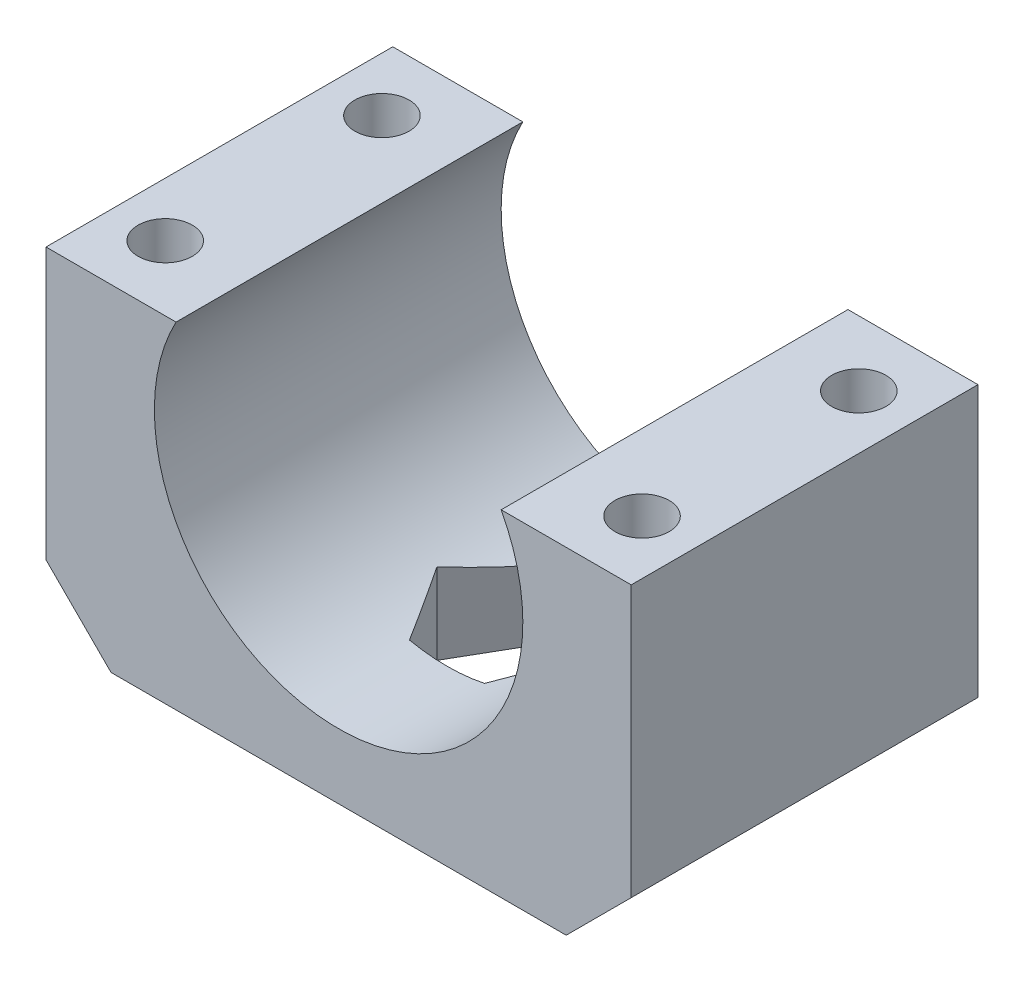
ISO-10303-21;
HEADER;
FILE_DESCRIPTION(('STEP AP214'),'2;1');
FILE_NAME('part.step','',(''),(''),'','','');
FILE_SCHEMA(('AUTOMOTIVE_DESIGN { 1 0 10303 214 1 1 1 1 }'));
ENDSEC;
DATA;
#1=APPLICATION_CONTEXT('core data for automotive mechanical design processes');
#2=APPLICATION_PROTOCOL_DEFINITION('international standard','automotive_design',2000,#1);
#3=PRODUCT_CONTEXT('',#1,'mechanical');
#4=PRODUCT('Part','Part','',(#3));
#5=PRODUCT_RELATED_PRODUCT_CATEGORY('part','',(#4));
#6=PRODUCT_DEFINITION_FORMATION('','',#4);
#7=PRODUCT_DEFINITION_CONTEXT('part definition',#1,'design');
#8=PRODUCT_DEFINITION('design','',#6,#7);
#9=PRODUCT_DEFINITION_SHAPE('','',#8);
#10=(LENGTH_UNIT() NAMED_UNIT(*) SI_UNIT(.MILLI.,.METRE.));
#11=(NAMED_UNIT(*) PLANE_ANGLE_UNIT() SI_UNIT($,.RADIAN.));
#12=(NAMED_UNIT(*) SI_UNIT($,.STERADIAN.) SOLID_ANGLE_UNIT());
#13=UNCERTAINTY_MEASURE_WITH_UNIT(LENGTH_MEASURE(1.E-05),#10,'distance_accuracy_value','');
#14=(GEOMETRIC_REPRESENTATION_CONTEXT(3) GLOBAL_UNCERTAINTY_ASSIGNED_CONTEXT((#13)) GLOBAL_UNIT_ASSIGNED_CONTEXT((#10,
#11,#12)) REPRESENTATION_CONTEXT('',''));
#15=CARTESIAN_POINT('',(0.,0.,0.));
#16=DIRECTION('',(0.,0.,1.));
#17=DIRECTION('',(1.,0.,0.));
#18=AXIS2_PLACEMENT_3D('',#15,#16,#17);
#19=CARTESIAN_POINT('',(11.,4.,13.));
#20=DIRECTION('',(0.,1.,0.));
#21=DIRECTION('',(0.,0.,1.));
#22=AXIS2_PLACEMENT_3D('',#19,#20,#21);
#23=CYLINDRICAL_SURFACE('',#22,1.24999999999999);
#24=CARTESIAN_POINT('',(11.,-11.5,13.));
#25=DIRECTION('',(0.,1.,0.));
#26=DIRECTION('',(0.,0.,1.));
#27=AXIS2_PLACEMENT_3D('',#24,#25,#26);
#28=CIRCLE('',#27,1.24999999999999);
#29=CARTESIAN_POINT('',(10.5,-11.5,14.1456439237389));
#30=VERTEX_POINT('',#29);
#31=CARTESIAN_POINT('',(10.5,-11.5,11.8543560762611));
#32=VERTEX_POINT('',#31);
#33=EDGE_CURVE('E290',#30,#32,#28,.F.);
#34=ORIENTED_EDGE('',*,*,#33,.T.);
#35=CARTESIAN_POINT('',(11.,-11.,13.));
#36=DIRECTION('',(-0.707106781186546,0.707106781186549,0.));
#37=DIRECTION('',(0.707106781186549,0.707106781186546,0.));
#38=AXIS2_PLACEMENT_3D('',#35,#36,#37);
#39=ELLIPSE('',#38,1.76776695296635,1.24999999999999);
#40=EDGE_CURVE('E185',#32,#30,#39,.F.);
#41=ORIENTED_EDGE('',*,*,#40,.T.);
#42=EDGE_LOOP('',(#34,#41));
#43=FACE_BOUND('',#42,.T.);
#44=CARTESIAN_POINT('',(11.,4.,13.));
#45=DIRECTION('',(0.,1.,0.));
#46=DIRECTION('',(0.,0.,1.));
#47=AXIS2_PLACEMENT_3D('',#44,#45,#46);
#48=CIRCLE('',#47,1.24999999999999);
#49=CARTESIAN_POINT('',(11.,4.,14.25));
#50=VERTEX_POINT('',#49);
#51=EDGE_CURVE('E170',#50,#50,#48,.T.);
#52=ORIENTED_EDGE('',*,*,#51,.T.);
#53=EDGE_LOOP('',(#52));
#54=FACE_BOUND('',#53,.T.);
#55=ADVANCED_FACE('F16',(#43,#54),#23,.F.);
#56=CARTESIAN_POINT('',(11.,4.,3.));
#57=DIRECTION('',(0.,1.,0.));
#58=DIRECTION('',(0.,0.,1.));
#59=AXIS2_PLACEMENT_3D('',#56,#57,#58);
#60=CYLINDRICAL_SURFACE('',#59,1.24999999999999);
#61=CARTESIAN_POINT('',(11.,-11.,3.));
#62=DIRECTION('',(-0.707106781186546,0.707106781186549,0.));
#63=DIRECTION('',(0.707106781186549,0.707106781186546,0.));
#64=AXIS2_PLACEMENT_3D('',#61,#62,#63);
#65=ELLIPSE('',#64,1.76776695296635,1.24999999999999);
#66=CARTESIAN_POINT('',(10.5,-11.5,1.85435607626106));
#67=VERTEX_POINT('',#66);
#68=CARTESIAN_POINT('',(10.5,-11.5,4.14564392373894));
#69=VERTEX_POINT('',#68);
#70=EDGE_CURVE('E171',#67,#69,#65,.F.);
#71=ORIENTED_EDGE('',*,*,#70,.T.);
#72=CARTESIAN_POINT('',(11.,-11.5,3.));
#73=DIRECTION('',(0.,1.,0.));
#74=DIRECTION('',(0.,0.,1.));
#75=AXIS2_PLACEMENT_3D('',#72,#73,#74);
#76=CIRCLE('',#75,1.24999999999999);
#77=EDGE_CURVE('E191',#69,#67,#76,.F.);
#78=ORIENTED_EDGE('',*,*,#77,.T.);
#79=EDGE_LOOP('',(#71,#78));
#80=FACE_BOUND('',#79,.T.);
#81=CARTESIAN_POINT('',(11.,4.,3.));
#82=DIRECTION('',(0.,1.,0.));
#83=DIRECTION('',(0.,0.,1.));
#84=AXIS2_PLACEMENT_3D('',#81,#82,#83);
#85=CIRCLE('',#84,1.24999999999999);
#86=CARTESIAN_POINT('',(11.,4.,4.24999999999999));
#87=VERTEX_POINT('',#86);
#88=EDGE_CURVE('E157',#87,#87,#85,.T.);
#89=ORIENTED_EDGE('',*,*,#88,.T.);
#90=EDGE_LOOP('',(#89));
#91=FACE_BOUND('',#90,.T.);
#92=ADVANCED_FACE('F399',(#80,#91),#60,.F.);
#93=CARTESIAN_POINT('',(-11.,4.,13.));
#94=DIRECTION('',(0.,1.,0.));
#95=DIRECTION('',(0.,0.,1.));
#96=AXIS2_PLACEMENT_3D('',#93,#94,#95);
#97=CYLINDRICAL_SURFACE('',#96,1.24999999999999);
#98=CARTESIAN_POINT('',(-11.,4.,13.));
#99=DIRECTION('',(0.,1.,0.));
#100=DIRECTION('',(0.,0.,1.));
#101=AXIS2_PLACEMENT_3D('',#98,#99,#100);
#102=CIRCLE('',#101,1.24999999999999);
#103=CARTESIAN_POINT('',(-11.,4.,14.25));
#104=VERTEX_POINT('',#103);
#105=EDGE_CURVE('E134',#104,#104,#102,.T.);
#106=ORIENTED_EDGE('',*,*,#105,.T.);
#107=EDGE_LOOP('',(#106));
#108=FACE_BOUND('',#107,.T.);
#109=CARTESIAN_POINT('',(-11.,-11.,13.));
#110=DIRECTION('',(0.707106781186549,0.707106781186546,0.));
#111=DIRECTION('',(-0.707106781186546,0.707106781186549,0.));
#112=AXIS2_PLACEMENT_3D('',#109,#110,#111);
#113=ELLIPSE('',#112,1.76776695296635,1.24999999999999);
#114=CARTESIAN_POINT('',(-10.5,-11.5,14.145643923739));
#115=VERTEX_POINT('',#114);
#116=CARTESIAN_POINT('',(-10.5,-11.5,11.8543560762611));
#117=VERTEX_POINT('',#116);
#118=EDGE_CURVE('E120',#115,#117,#113,.F.);
#119=ORIENTED_EDGE('',*,*,#118,.T.);
#120=CARTESIAN_POINT('',(-11.,-11.5,13.));
#121=DIRECTION('',(0.,1.,0.));
#122=DIRECTION('',(0.,0.,1.));
#123=AXIS2_PLACEMENT_3D('',#120,#121,#122);
#124=CIRCLE('',#123,1.24999999999999);
#125=EDGE_CURVE('E113',#117,#115,#124,.F.);
#126=ORIENTED_EDGE('',*,*,#125,.T.);
#127=EDGE_LOOP('',(#119,#126));
#128=FACE_BOUND('',#127,.T.);
#129=ADVANCED_FACE('F293',(#108,#128),#97,.F.);
#130=CARTESIAN_POINT('',(-11.,4.,3.));
#131=DIRECTION('',(0.,1.,0.));
#132=DIRECTION('',(0.,0.,1.));
#133=AXIS2_PLACEMENT_3D('',#130,#131,#132);
#134=CYLINDRICAL_SURFACE('',#133,1.24999999999999);
#135=CARTESIAN_POINT('',(-11.,4.,3.));
#136=DIRECTION('',(0.,1.,0.));
#137=DIRECTION('',(0.,0.,1.));
#138=AXIS2_PLACEMENT_3D('',#135,#136,#137);
#139=CIRCLE('',#138,1.24999999999999);
#140=CARTESIAN_POINT('',(-11.,4.,4.24999999999999));
#141=VERTEX_POINT('',#140);
#142=EDGE_CURVE('E156',#141,#141,#139,.T.);
#143=ORIENTED_EDGE('',*,*,#142,.T.);
#144=EDGE_LOOP('',(#143));
#145=FACE_BOUND('',#144,.T.);
#146=CARTESIAN_POINT('',(-11.,-11.,3.));
#147=DIRECTION('',(0.707106781186549,0.707106781186546,0.));
#148=DIRECTION('',(-0.707106781186546,0.707106781186549,0.));
#149=AXIS2_PLACEMENT_3D('',#146,#147,#148);
#150=ELLIPSE('',#149,1.76776695296635,1.24999999999999);
#151=CARTESIAN_POINT('',(-10.5,-11.5,4.14564392373895));
#152=VERTEX_POINT('',#151);
#153=CARTESIAN_POINT('',(-10.5,-11.5,1.85435607626105));
#154=VERTEX_POINT('',#153);
#155=EDGE_CURVE('E95',#152,#154,#150,.F.);
#156=ORIENTED_EDGE('',*,*,#155,.T.);
#157=CARTESIAN_POINT('',(-11.,-11.5,3.));
#158=DIRECTION('',(0.,1.,0.));
#159=DIRECTION('',(0.,0.,1.));
#160=AXIS2_PLACEMENT_3D('',#157,#158,#159);
#161=CIRCLE('',#160,1.24999999999999);
#162=EDGE_CURVE('E19',#154,#152,#161,.F.);
#163=ORIENTED_EDGE('',*,*,#162,.T.);
#164=EDGE_LOOP('',(#156,#163));
#165=FACE_BOUND('',#164,.T.);
#166=ADVANCED_FACE('F111',(#145,#165),#134,.F.);
#167=CARTESIAN_POINT('',(-13.5,-11.5,16.));
#168=DIRECTION('',(0.,1.,0.));
#169=DIRECTION('',(0.,0.,1.));
#170=AXIS2_PLACEMENT_3D('',#167,#168,#169);
#171=PLANE('',#170);
#172=DIRECTION('',(0.,0.,1.));
#173=VECTOR('',#172,1.);
#174=CARTESIAN_POINT('',(10.5,-11.5,16.));
#175=LINE('',#174,#173);
#176=CARTESIAN_POINT('',(10.5,-11.5,0.));
#177=VERTEX_POINT('',#176);
#178=EDGE_CURVE('E178',#177,#67,#175,.T.);
#179=ORIENTED_EDGE('',*,*,#178,.T.);
#180=ORIENTED_EDGE('',*,*,#77,.F.);
#181=DIRECTION('',(0.,0.,1.));
#182=VECTOR('',#181,1.);
#183=CARTESIAN_POINT('',(10.5,-11.5,16.));
#184=LINE('',#183,#182);
#185=EDGE_CURVE('E188',#69,#32,#184,.T.);
#186=ORIENTED_EDGE('',*,*,#185,.T.);
#187=ORIENTED_EDGE('',*,*,#33,.F.);
#188=DIRECTION('',(0.,0.,1.));
#189=VECTOR('',#188,1.);
#190=CARTESIAN_POINT('',(10.5,-11.5,16.));
#191=LINE('',#190,#189);
#192=CARTESIAN_POINT('',(10.5,-11.5,16.));
#193=VERTEX_POINT('',#192);
#194=EDGE_CURVE('E180',#30,#193,#191,.T.);
#195=ORIENTED_EDGE('',*,*,#194,.T.);
#196=DIRECTION('',(1.,0.,0.));
#197=VECTOR('',#196,1.);
#198=CARTESIAN_POINT('',(0.,-11.5,16.));
#199=LINE('',#198,#197);
#200=CARTESIAN_POINT('',(-10.5,-11.5,16.));
#201=VERTEX_POINT('',#200);
#202=EDGE_CURVE('E151',#201,#193,#199,.T.);
#203=ORIENTED_EDGE('',*,*,#202,.F.);
#204=DIRECTION('',(0.,0.,1.));
#205=VECTOR('',#204,1.);
#206=CARTESIAN_POINT('',(-10.5,-11.5,16.));
#207=LINE('',#206,#205);
#208=EDGE_CURVE('E122',#201,#115,#207,.F.);
#209=ORIENTED_EDGE('',*,*,#208,.T.);
#210=ORIENTED_EDGE('',*,*,#125,.F.);
#211=DIRECTION('',(0.,0.,1.));
#212=VECTOR('',#211,1.);
#213=CARTESIAN_POINT('',(-10.5,-11.5,16.));
#214=LINE('',#213,#212);
#215=EDGE_CURVE('E106',#117,#152,#214,.F.);
#216=ORIENTED_EDGE('',*,*,#215,.T.);
#217=ORIENTED_EDGE('',*,*,#162,.F.);
#218=DIRECTION('',(0.,0.,1.));
#219=VECTOR('',#218,1.);
#220=CARTESIAN_POINT('',(-10.5,-11.5,16.));
#221=LINE('',#220,#219);
#222=CARTESIAN_POINT('',(-10.5,-11.5,0.));
#223=VERTEX_POINT('',#222);
#224=EDGE_CURVE('E109',#154,#223,#221,.F.);
#225=ORIENTED_EDGE('',*,*,#224,.T.);
#226=DIRECTION('',(1.,0.,0.));
#227=VECTOR('',#226,1.);
#228=CARTESIAN_POINT('',(0.,-11.5,0.));
#229=LINE('',#228,#227);
#230=EDGE_CURVE('E249',#223,#177,#229,.T.);
#231=ORIENTED_EDGE('',*,*,#230,.T.);
#232=EDGE_LOOP('',(#179,#180,#186,#187,#195,#203,#209,#210,#216,#217,#225,#231));
#233=FACE_BOUND('',#232,.T.);
#234=DIRECTION('',(-0.5,0.,0.866025403784439));
#235=VECTOR('',#234,1.);
#236=CARTESIAN_POINT('',(-1.73205080756888,-11.5,5.));
#237=LINE('',#236,#235);
#238=CARTESIAN_POINT('',(-1.73205080756888,-11.5,5.));
#239=VERTEX_POINT('',#238);
#240=CARTESIAN_POINT('',(-3.46410161513776,-11.5,8.));
#241=VERTEX_POINT('',#240);
#242=EDGE_CURVE('E213',#239,#241,#237,.T.);
#243=ORIENTED_EDGE('',*,*,#242,.T.);
#244=DIRECTION('',(0.5,0.,0.866025403784439));
#245=VECTOR('',#244,1.);
#246=CARTESIAN_POINT('',(-3.46410161513776,-11.5,8.));
#247=LINE('',#246,#245);
#248=CARTESIAN_POINT('',(-1.73205080756888,-11.5,11.));
#249=VERTEX_POINT('',#248);
#250=EDGE_CURVE('E220',#241,#249,#247,.T.);
#251=ORIENTED_EDGE('',*,*,#250,.T.);
#252=DIRECTION('',(1.,0.,0.));
#253=VECTOR('',#252,1.);
#254=CARTESIAN_POINT('',(-1.73205080756888,-11.5,11.));
#255=LINE('',#254,#253);
#256=CARTESIAN_POINT('',(1.73205080756888,-11.5,11.));
#257=VERTEX_POINT('',#256);
#258=EDGE_CURVE('E226',#249,#257,#255,.T.);
#259=ORIENTED_EDGE('',*,*,#258,.T.);
#260=DIRECTION('',(0.5,0.,-0.866025403784439));
#261=VECTOR('',#260,1.);
#262=CARTESIAN_POINT('',(1.73205080756888,-11.5,11.));
#263=LINE('',#262,#261);
#264=CARTESIAN_POINT('',(3.46410161513775,-11.5,8.));
#265=VERTEX_POINT('',#264);
#266=EDGE_CURVE('E229',#257,#265,#263,.T.);
#267=ORIENTED_EDGE('',*,*,#266,.T.);
#268=DIRECTION('',(-0.5,0.,-0.866025403784439));
#269=VECTOR('',#268,1.);
#270=CARTESIAN_POINT('',(3.46410161513775,-11.5,8.));
#271=LINE('',#270,#269);
#272=CARTESIAN_POINT('',(1.73205080756888,-11.5,5.));
#273=VERTEX_POINT('',#272);
#274=EDGE_CURVE('E239',#265,#273,#271,.T.);
#275=ORIENTED_EDGE('',*,*,#274,.T.);
#276=DIRECTION('',(-1.,0.,0.));
#277=VECTOR('',#276,1.);
#278=CARTESIAN_POINT('',(1.73205080756887,-11.5,5.));
#279=LINE('',#278,#277);
#280=EDGE_CURVE('E233',#273,#239,#279,.T.);
#281=ORIENTED_EDGE('',*,*,#280,.T.);
#282=EDGE_LOOP('',(#243,#251,#259,#267,#275,#281));
#283=FACE_BOUND('',#282,.T.);
#284=ADVANCED_FACE('F116',(#233,#283),#171,.F.);
#285=CARTESIAN_POINT('',(13.5,-8.5,16.));
#286=DIRECTION('',(-0.707106781186546,0.707106781186549,0.));
#287=DIRECTION('',(-0.707106781186549,-0.707106781186546,0.));
#288=AXIS2_PLACEMENT_3D('',#285,#286,#287);
#289=PLANE('',#288);
#290=ORIENTED_EDGE('',*,*,#178,.F.);
#291=DIRECTION('',(0.707106781186549,0.707106781186547,0.));
#292=VECTOR('',#291,1.);
#293=CARTESIAN_POINT('',(10.5,-11.5,0.));
#294=LINE('',#293,#292);
#295=CARTESIAN_POINT('',(13.5,-8.5,0.));
#296=VERTEX_POINT('',#295);
#297=EDGE_CURVE('E210',#177,#296,#294,.T.);
#298=ORIENTED_EDGE('',*,*,#297,.T.);
#299=DIRECTION('',(0.,0.,1.));
#300=VECTOR('',#299,1.);
#301=CARTESIAN_POINT('',(13.5,-8.5,16.));
#302=LINE('',#301,#300);
#303=CARTESIAN_POINT('',(13.5,-8.5,16.));
#304=VERTEX_POINT('',#303);
#305=EDGE_CURVE('E167',#296,#304,#302,.T.);
#306=ORIENTED_EDGE('',*,*,#305,.T.);
#307=DIRECTION('',(0.707106781186548,0.707106781186546,0.));
#308=VECTOR('',#307,1.);
#309=CARTESIAN_POINT('',(10.5,-11.5,16.));
#310=LINE('',#309,#308);
#311=EDGE_CURVE('E164',#193,#304,#310,.T.);
#312=ORIENTED_EDGE('',*,*,#311,.F.);
#313=ORIENTED_EDGE('',*,*,#194,.F.);
#314=ORIENTED_EDGE('',*,*,#40,.F.);
#315=ORIENTED_EDGE('',*,*,#185,.F.);
#316=ORIENTED_EDGE('',*,*,#70,.F.);
#317=EDGE_LOOP('',(#290,#298,#306,#312,#313,#314,#315,#316));
#318=FACE_BOUND('',#317,.T.);
#319=ADVANCED_FACE('F390',(#318),#289,.F.);
#320=CARTESIAN_POINT('',(13.5,-11.5,16.));
#321=DIRECTION('',(-1.,0.,0.));
#322=DIRECTION('',(0.,0.,1.));
#323=AXIS2_PLACEMENT_3D('',#320,#321,#322);
#324=PLANE('',#323);
#325=ORIENTED_EDGE('',*,*,#305,.F.);
#326=DIRECTION('',(0.,1.,0.));
#327=VECTOR('',#326,1.);
#328=CARTESIAN_POINT('',(13.5,0.,0.));
#329=LINE('',#328,#327);
#330=CARTESIAN_POINT('',(13.5,4.,0.));
#331=VERTEX_POINT('',#330);
#332=EDGE_CURVE('E152',#296,#331,#329,.T.);
#333=ORIENTED_EDGE('',*,*,#332,.T.);
#334=DIRECTION('',(0.,0.,1.));
#335=VECTOR('',#334,1.);
#336=CARTESIAN_POINT('',(13.5,4.,16.));
#337=LINE('',#336,#335);
#338=CARTESIAN_POINT('',(13.5,4.,16.));
#339=VERTEX_POINT('',#338);
#340=EDGE_CURVE('E153',#331,#339,#337,.T.);
#341=ORIENTED_EDGE('',*,*,#340,.T.);
#342=DIRECTION('',(0.,1.,0.));
#343=VECTOR('',#342,1.);
#344=CARTESIAN_POINT('',(13.5,0.,16.));
#345=LINE('',#344,#343);
#346=EDGE_CURVE('E160',#304,#339,#345,.T.);
#347=ORIENTED_EDGE('',*,*,#346,.F.);
#348=EDGE_LOOP('',(#325,#333,#341,#347));
#349=FACE_BOUND('',#348,.T.);
#350=ADVANCED_FACE('F387',(#349),#324,.F.);
#351=CARTESIAN_POINT('',(7.5,4.,16.));
#352=DIRECTION('',(0.,-1.,0.));
#353=DIRECTION('',(1.,0.,0.));
#354=AXIS2_PLACEMENT_3D('',#351,#352,#353);
#355=PLANE('',#354);
#356=DIRECTION('',(0.,0.,-1.));
#357=VECTOR('',#356,1.);
#358=CARTESIAN_POINT('',(7.5,4.,16.));
#359=LINE('',#358,#357);
#360=CARTESIAN_POINT('',(7.5,4.,0.));
#361=VERTEX_POINT('',#360);
#362=CARTESIAN_POINT('',(7.5,4.,16.));
#363=VERTEX_POINT('',#362);
#364=EDGE_CURVE('E148',#361,#363,#359,.F.);
#365=ORIENTED_EDGE('',*,*,#364,.T.);
#366=DIRECTION('',(1.,0.,0.));
#367=VECTOR('',#366,1.);
#368=CARTESIAN_POINT('',(0.,4.,16.));
#369=LINE('',#368,#367);
#370=EDGE_CURVE('E163',#339,#363,#369,.F.);
#371=ORIENTED_EDGE('',*,*,#370,.F.);
#372=ORIENTED_EDGE('',*,*,#340,.F.);
#373=DIRECTION('',(1.,0.,0.));
#374=VECTOR('',#373,1.);
#375=CARTESIAN_POINT('',(0.,4.,0.));
#376=LINE('',#375,#374);
#377=EDGE_CURVE('E147',#331,#361,#376,.F.);
#378=ORIENTED_EDGE('',*,*,#377,.T.);
#379=EDGE_LOOP('',(#365,#371,#372,#378));
#380=FACE_BOUND('',#379,.T.);
#381=ORIENTED_EDGE('',*,*,#88,.F.);
#382=EDGE_LOOP('',(#381));
#383=FACE_BOUND('',#382,.T.);
#384=ORIENTED_EDGE('',*,*,#51,.F.);
#385=EDGE_LOOP('',(#384));
#386=FACE_BOUND('',#385,.T.);
#387=ADVANCED_FACE('F356',(#380,#383,#386),#355,.F.);
#388=CARTESIAN_POINT('',(-13.5,4.,16.));
#389=DIRECTION('',(0.,-1.,0.));
#390=DIRECTION('',(1.,0.,0.));
#391=AXIS2_PLACEMENT_3D('',#388,#389,#390);
#392=PLANE('',#391);
#393=DIRECTION('',(0.,0.,-1.));
#394=VECTOR('',#393,1.);
#395=CARTESIAN_POINT('',(-13.5,4.,16.));
#396=LINE('',#395,#394);
#397=CARTESIAN_POINT('',(-13.5,4.,0.));
#398=VERTEX_POINT('',#397);
#399=CARTESIAN_POINT('',(-13.5,4.,16.));
#400=VERTEX_POINT('',#399);
#401=EDGE_CURVE('E129',#398,#400,#396,.F.);
#402=ORIENTED_EDGE('',*,*,#401,.T.);
#403=DIRECTION('',(1.,0.,0.));
#404=VECTOR('',#403,1.);
#405=CARTESIAN_POINT('',(0.,4.,16.));
#406=LINE('',#405,#404);
#407=CARTESIAN_POINT('',(-7.5,4.,16.));
#408=VERTEX_POINT('',#407);
#409=EDGE_CURVE('E141',#408,#400,#406,.F.);
#410=ORIENTED_EDGE('',*,*,#409,.F.);
#411=DIRECTION('',(0.,0.,-1.));
#412=VECTOR('',#411,1.);
#413=CARTESIAN_POINT('',(-7.5,4.,16.));
#414=LINE('',#413,#412);
#415=CARTESIAN_POINT('',(-7.5,4.,0.));
#416=VERTEX_POINT('',#415);
#417=EDGE_CURVE('E144',#408,#416,#414,.T.);
#418=ORIENTED_EDGE('',*,*,#417,.T.);
#419=DIRECTION('',(1.,0.,0.));
#420=VECTOR('',#419,1.);
#421=CARTESIAN_POINT('',(0.,4.,0.));
#422=LINE('',#421,#420);
#423=EDGE_CURVE('E205',#416,#398,#422,.F.);
#424=ORIENTED_EDGE('',*,*,#423,.T.);
#425=EDGE_LOOP('',(#402,#410,#418,#424));
#426=FACE_BOUND('',#425,.T.);
#427=ORIENTED_EDGE('',*,*,#105,.F.);
#428=EDGE_LOOP('',(#427));
#429=FACE_BOUND('',#428,.T.);
#430=ORIENTED_EDGE('',*,*,#142,.F.);
#431=EDGE_LOOP('',(#430));
#432=FACE_BOUND('',#431,.T.);
#433=ADVANCED_FACE('F364',(#426,#429,#432),#392,.F.);
#434=CARTESIAN_POINT('',(-13.5,-11.5,16.));
#435=DIRECTION('',(1.,0.,0.));
#436=DIRECTION('',(0.,0.,-1.));
#437=AXIS2_PLACEMENT_3D('',#434,#435,#436);
#438=PLANE('',#437);
#439=DIRECTION('',(0.,0.,1.));
#440=VECTOR('',#439,1.);
#441=CARTESIAN_POINT('',(-13.5,-8.49999999999999,16.));
#442=LINE('',#441,#440);
#443=CARTESIAN_POINT('',(-13.5,-8.49999999999999,0.));
#444=VERTEX_POINT('',#443);
#445=CARTESIAN_POINT('',(-13.5,-8.49999999999999,16.));
#446=VERTEX_POINT('',#445);
#447=EDGE_CURVE('E230',#444,#446,#442,.T.);
#448=ORIENTED_EDGE('',*,*,#447,.T.);
#449=DIRECTION('',(0.,1.,0.));
#450=VECTOR('',#449,1.);
#451=CARTESIAN_POINT('',(-13.5,0.,16.));
#452=LINE('',#451,#450);
#453=EDGE_CURVE('E137',#400,#446,#452,.F.);
#454=ORIENTED_EDGE('',*,*,#453,.F.);
#455=ORIENTED_EDGE('',*,*,#401,.F.);
#456=DIRECTION('',(0.,1.,0.));
#457=VECTOR('',#456,1.);
#458=CARTESIAN_POINT('',(-13.5,0.,0.));
#459=LINE('',#458,#457);
#460=EDGE_CURVE('E201',#398,#444,#459,.F.);
#461=ORIENTED_EDGE('',*,*,#460,.T.);
#462=EDGE_LOOP('',(#448,#454,#455,#461));
#463=FACE_BOUND('',#462,.T.);
#464=ADVANCED_FACE('F307',(#463),#438,.F.);
#465=CARTESIAN_POINT('',(-10.5,-11.5,16.));
#466=DIRECTION('',(0.707106781186549,0.707106781186546,0.));
#467=DIRECTION('',(-0.707106781186546,0.707106781186549,0.));
#468=AXIS2_PLACEMENT_3D('',#465,#466,#467);
#469=PLANE('',#468);
#470=ORIENTED_EDGE('',*,*,#447,.F.);
#471=DIRECTION('',(0.707106781186546,-0.707106781186549,0.));
#472=VECTOR('',#471,1.);
#473=CARTESIAN_POINT('',(-13.5,-8.49999999999999,0.));
#474=LINE('',#473,#472);
#475=EDGE_CURVE('E204',#444,#223,#474,.T.);
#476=ORIENTED_EDGE('',*,*,#475,.T.);
#477=ORIENTED_EDGE('',*,*,#224,.F.);
#478=ORIENTED_EDGE('',*,*,#155,.F.);
#479=ORIENTED_EDGE('',*,*,#215,.F.);
#480=ORIENTED_EDGE('',*,*,#118,.F.);
#481=ORIENTED_EDGE('',*,*,#208,.F.);
#482=DIRECTION('',(0.707106781186546,-0.707106781186549,0.));
#483=VECTOR('',#482,1.);
#484=CARTESIAN_POINT('',(-13.5,-8.49999999999999,16.));
#485=LINE('',#484,#483);
#486=EDGE_CURVE('E140',#446,#201,#485,.T.);
#487=ORIENTED_EDGE('',*,*,#486,.F.);
#488=EDGE_LOOP('',(#470,#476,#477,#478,#479,#480,#481,#487));
#489=FACE_BOUND('',#488,.T.);
#490=ADVANCED_FACE('F104',(#489),#469,.F.);
#491=CARTESIAN_POINT('',(-1.73205080756888,-16.,11.));
#492=DIRECTION('',(0.,0.,1.));
#493=DIRECTION('',(1.,0.,0.));
#494=AXIS2_PLACEMENT_3D('',#491,#492,#493);
#495=PLANE('',#494);
#496=CARTESIAN_POINT('',(0.,0.,11.));
#497=DIRECTION('',(0.,0.,-1.));
#498=DIRECTION('',(-1.,0.,0.));
#499=AXIS2_PLACEMENT_3D('',#496,#497,#498);
#500=CIRCLE('',#499,8.5);
#501=CARTESIAN_POINT('',(-1.73205080756888,-8.32165848854662,11.));
#502=VERTEX_POINT('',#501);
#503=CARTESIAN_POINT('',(1.73205080756888,-8.32165848854662,11.));
#504=VERTEX_POINT('',#503);
#505=EDGE_CURVE('E198',#502,#504,#500,.F.);
#506=ORIENTED_EDGE('',*,*,#505,.T.);
#507=DIRECTION('',(0.,1.,0.));
#508=VECTOR('',#507,1.);
#509=CARTESIAN_POINT('',(1.73205080756888,-16.,11.));
#510=LINE('',#509,#508);
#511=EDGE_CURVE('E242',#504,#257,#510,.F.);
#512=ORIENTED_EDGE('',*,*,#511,.T.);
#513=ORIENTED_EDGE('',*,*,#258,.F.);
#514=DIRECTION('',(0.,1.,0.));
#515=VECTOR('',#514,1.);
#516=CARTESIAN_POINT('',(-1.73205080756888,-16.,11.));
#517=LINE('',#516,#515);
#518=EDGE_CURVE('E223',#249,#502,#517,.T.);
#519=ORIENTED_EDGE('',*,*,#518,.T.);
#520=EDGE_LOOP('',(#506,#512,#513,#519));
#521=FACE_BOUND('',#520,.T.);
#522=ADVANCED_FACE('F438',(#521),#495,.F.);
#523=CARTESIAN_POINT('',(1.73205080756888,-16.,11.));
#524=DIRECTION('',(0.866025403784439,0.,0.5));
#525=DIRECTION('',(0.5,0.,-0.866025403784439));
#526=AXIS2_PLACEMENT_3D('',#523,#524,#525);
#527=PLANE('',#526);
#528=CARTESIAN_POINT('',(0.,0.,14.));
#529=DIRECTION('',(0.866025403784439,0.,0.5));
#530=DIRECTION('',(0.5,0.,-0.866025403784439));
#531=AXIS2_PLACEMENT_3D('',#528,#529,#530);
#532=ELLIPSE('',#531,17.,8.5);
#533=CARTESIAN_POINT('',(3.46410161513775,-7.76208734813001,8.));
#534=VERTEX_POINT('',#533);
#535=EDGE_CURVE('E273',#504,#534,#532,.T.);
#536=ORIENTED_EDGE('',*,*,#535,.T.);
#537=DIRECTION('',(0.,1.,0.));
#538=VECTOR('',#537,1.);
#539=CARTESIAN_POINT('',(3.46410161513775,-16.,8.));
#540=LINE('',#539,#538);
#541=EDGE_CURVE('E236',#534,#265,#540,.F.);
#542=ORIENTED_EDGE('',*,*,#541,.T.);
#543=ORIENTED_EDGE('',*,*,#266,.F.);
#544=ORIENTED_EDGE('',*,*,#511,.F.);
#545=EDGE_LOOP('',(#536,#542,#543,#544));
#546=FACE_BOUND('',#545,.T.);
#547=ADVANCED_FACE('F434',(#546),#527,.F.);
#548=CARTESIAN_POINT('',(3.46410161513775,-16.,8.));
#549=DIRECTION('',(0.866025403784439,0.,-0.5));
#550=DIRECTION('',(-0.5,0.,-0.866025403784439));
#551=AXIS2_PLACEMENT_3D('',#548,#549,#550);
#552=PLANE('',#551);
#553=CARTESIAN_POINT('',(0.,0.,2.));
#554=DIRECTION('',(0.866025403784439,0.,-0.5));
#555=DIRECTION('',(-0.5,0.,-0.866025403784439));
#556=AXIS2_PLACEMENT_3D('',#553,#554,#555);
#557=ELLIPSE('',#556,17.,8.5);
#558=CARTESIAN_POINT('',(1.73205080756888,-8.32165848854662,5.));
#559=VERTEX_POINT('',#558);
#560=EDGE_CURVE('E270',#534,#559,#557,.T.);
#561=ORIENTED_EDGE('',*,*,#560,.T.);
#562=DIRECTION('',(0.,1.,0.));
#563=VECTOR('',#562,1.);
#564=CARTESIAN_POINT('',(1.73205080756888,-16.,5.));
#565=LINE('',#564,#563);
#566=EDGE_CURVE('E217',#559,#273,#565,.F.);
#567=ORIENTED_EDGE('',*,*,#566,.T.);
#568=ORIENTED_EDGE('',*,*,#274,.F.);
#569=ORIENTED_EDGE('',*,*,#541,.F.);
#570=EDGE_LOOP('',(#561,#567,#568,#569));
#571=FACE_BOUND('',#570,.T.);
#572=ADVANCED_FACE('F430',(#571),#552,.F.);
#573=CARTESIAN_POINT('',(1.73205080756887,-16.,5.));
#574=DIRECTION('',(0.,0.,-1.));
#575=DIRECTION('',(-1.,0.,0.));
#576=AXIS2_PLACEMENT_3D('',#573,#574,#575);
#577=PLANE('',#576);
#578=CARTESIAN_POINT('',(0.,0.,5.));
#579=DIRECTION('',(0.,0.,-1.));
#580=DIRECTION('',(-1.,0.,0.));
#581=AXIS2_PLACEMENT_3D('',#578,#579,#580);
#582=CIRCLE('',#581,8.5);
#583=CARTESIAN_POINT('',(-1.73205080756888,-8.32165848854662,5.));
#584=VERTEX_POINT('',#583);
#585=EDGE_CURVE('E267',#559,#584,#582,.T.);
#586=ORIENTED_EDGE('',*,*,#585,.T.);
#587=DIRECTION('',(0.,1.,0.));
#588=VECTOR('',#587,1.);
#589=CARTESIAN_POINT('',(-1.73205080756888,-16.,5.));
#590=LINE('',#589,#588);
#591=EDGE_CURVE('E216',#584,#239,#590,.F.);
#592=ORIENTED_EDGE('',*,*,#591,.T.);
#593=ORIENTED_EDGE('',*,*,#280,.F.);
#594=ORIENTED_EDGE('',*,*,#566,.F.);
#595=EDGE_LOOP('',(#586,#592,#593,#594));
#596=FACE_BOUND('',#595,.T.);
#597=ADVANCED_FACE('F426',(#596),#577,.F.);
#598=CARTESIAN_POINT('',(-1.73205080756888,-16.,5.));
#599=DIRECTION('',(-0.866025403784439,0.,-0.5));
#600=DIRECTION('',(-0.5,0.,0.866025403784439));
#601=AXIS2_PLACEMENT_3D('',#598,#599,#600);
#602=PLANE('',#601);
#603=CARTESIAN_POINT('',(0.,0.,2.));
#604=DIRECTION('',(-0.866025403784439,0.,-0.5));
#605=DIRECTION('',(0.5,0.,-0.866025403784439));
#606=AXIS2_PLACEMENT_3D('',#603,#604,#605);
#607=ELLIPSE('',#606,17.,8.5);
#608=CARTESIAN_POINT('',(-3.46410161513776,-7.76208734813001,8.));
#609=VERTEX_POINT('',#608);
#610=EDGE_CURVE('E264',#584,#609,#607,.T.);
#611=ORIENTED_EDGE('',*,*,#610,.T.);
#612=DIRECTION('',(0.,1.,0.));
#613=VECTOR('',#612,1.);
#614=CARTESIAN_POINT('',(-3.46410161513776,-16.,8.));
#615=LINE('',#614,#613);
#616=EDGE_CURVE('E34',#609,#241,#615,.F.);
#617=ORIENTED_EDGE('',*,*,#616,.T.);
#618=ORIENTED_EDGE('',*,*,#242,.F.);
#619=ORIENTED_EDGE('',*,*,#591,.F.);
#620=EDGE_LOOP('',(#611,#617,#618,#619));
#621=FACE_BOUND('',#620,.T.);
#622=ADVANCED_FACE('F423',(#621),#602,.F.);
#623=CARTESIAN_POINT('',(-3.46410161513776,-16.,8.));
#624=DIRECTION('',(-0.866025403784439,0.,0.5));
#625=DIRECTION('',(0.5,0.,0.866025403784439));
#626=AXIS2_PLACEMENT_3D('',#623,#624,#625);
#627=PLANE('',#626);
#628=CARTESIAN_POINT('',(0.,0.,14.));
#629=DIRECTION('',(-0.866025403784439,0.,0.5));
#630=DIRECTION('',(-0.5,0.,-0.866025403784439));
#631=AXIS2_PLACEMENT_3D('',#628,#629,#630);
#632=ELLIPSE('',#631,17.,8.5);
#633=EDGE_CURVE('E262',#609,#502,#632,.T.);
#634=ORIENTED_EDGE('',*,*,#633,.T.);
#635=ORIENTED_EDGE('',*,*,#518,.F.);
#636=ORIENTED_EDGE('',*,*,#250,.F.);
#637=ORIENTED_EDGE('',*,*,#616,.F.);
#638=EDGE_LOOP('',(#634,#635,#636,#637));
#639=FACE_BOUND('',#638,.T.);
#640=ADVANCED_FACE('F420',(#639),#627,.F.);
#641=CARTESIAN_POINT('',(0.,0.,0.));
#642=DIRECTION('',(0.,0.,1.));
#643=DIRECTION('',(1.,0.,0.));
#644=AXIS2_PLACEMENT_3D('',#641,#642,#643);
#645=PLANE('',#644);
#646=ORIENTED_EDGE('',*,*,#297,.F.);
#647=ORIENTED_EDGE('',*,*,#230,.F.);
#648=ORIENTED_EDGE('',*,*,#475,.F.);
#649=ORIENTED_EDGE('',*,*,#460,.F.);
#650=ORIENTED_EDGE('',*,*,#423,.F.);
#651=CARTESIAN_POINT('',(0.,0.,0.));
#652=DIRECTION('',(0.,0.,-1.));
#653=DIRECTION('',(-1.,0.,0.));
#654=AXIS2_PLACEMENT_3D('',#651,#652,#653);
#655=CIRCLE('',#654,8.5);
#656=EDGE_CURVE('E25',#416,#361,#655,.F.);
#657=ORIENTED_EDGE('',*,*,#656,.T.);
#658=ORIENTED_EDGE('',*,*,#377,.F.);
#659=ORIENTED_EDGE('',*,*,#332,.F.);
#660=EDGE_LOOP('',(#646,#647,#648,#649,#650,#657,#658,#659));
#661=FACE_BOUND('',#660,.T.);
#662=ADVANCED_FACE('F370',(#661),#645,.F.);
#663=CARTESIAN_POINT('',(0.,0.,16.));
#664=DIRECTION('',(0.,0.,1.));
#665=DIRECTION('',(1.,0.,0.));
#666=AXIS2_PLACEMENT_3D('',#663,#664,#665);
#667=PLANE('',#666);
#668=ORIENTED_EDGE('',*,*,#453,.T.);
#669=ORIENTED_EDGE('',*,*,#486,.T.);
#670=ORIENTED_EDGE('',*,*,#202,.T.);
#671=ORIENTED_EDGE('',*,*,#311,.T.);
#672=ORIENTED_EDGE('',*,*,#346,.T.);
#673=ORIENTED_EDGE('',*,*,#370,.T.);
#674=CARTESIAN_POINT('',(0.,0.,16.));
#675=DIRECTION('',(0.,0.,-1.));
#676=DIRECTION('',(-1.,0.,0.));
#677=AXIS2_PLACEMENT_3D('',#674,#675,#676);
#678=CIRCLE('',#677,8.5);
#679=EDGE_CURVE('E11',#363,#408,#678,.T.);
#680=ORIENTED_EDGE('',*,*,#679,.T.);
#681=ORIENTED_EDGE('',*,*,#409,.T.);
#682=EDGE_LOOP('',(#668,#669,#670,#671,#672,#673,#680,#681));
#683=FACE_BOUND('',#682,.T.);
#684=ADVANCED_FACE('F299',(#683),#667,.T.);
#685=CARTESIAN_POINT('',(0.,0.,16.));
#686=DIRECTION('',(0.,0.,-1.));
#687=DIRECTION('',(-1.,0.,0.));
#688=AXIS2_PLACEMENT_3D('',#685,#686,#687);
#689=CYLINDRICAL_SURFACE('',#688,8.5);
#690=ORIENTED_EDGE('',*,*,#679,.F.);
#691=ORIENTED_EDGE('',*,*,#364,.F.);
#692=ORIENTED_EDGE('',*,*,#656,.F.);
#693=ORIENTED_EDGE('',*,*,#417,.F.);
#694=EDGE_LOOP('',(#690,#691,#692,#693));
#695=FACE_BOUND('',#694,.T.);
#696=ORIENTED_EDGE('',*,*,#610,.F.);
#697=ORIENTED_EDGE('',*,*,#585,.F.);
#698=ORIENTED_EDGE('',*,*,#560,.F.);
#699=ORIENTED_EDGE('',*,*,#535,.F.);
#700=ORIENTED_EDGE('',*,*,#505,.F.);
#701=ORIENTED_EDGE('',*,*,#633,.F.);
#702=EDGE_LOOP('',(#696,#697,#698,#699,#700,#701));
#703=FACE_BOUND('',#702,.T.);
#704=ADVANCED_FACE('F360',(#695,#703),#689,.F.);
#705=CLOSED_SHELL('',(#55,#92,#129,#166,#284,#319,#350,#387,#433,#464,#490,#522,#547,#572,#597,
#622,#640,#662,#684,#704));
#706=MANIFOLD_SOLID_BREP('B1',#705);
#707=ADVANCED_BREP_SHAPE_REPRESENTATION('',(#18,#706),#14);
#708=SHAPE_DEFINITION_REPRESENTATION(#9,#707);
ENDSEC;
END-ISO-10303-21;
